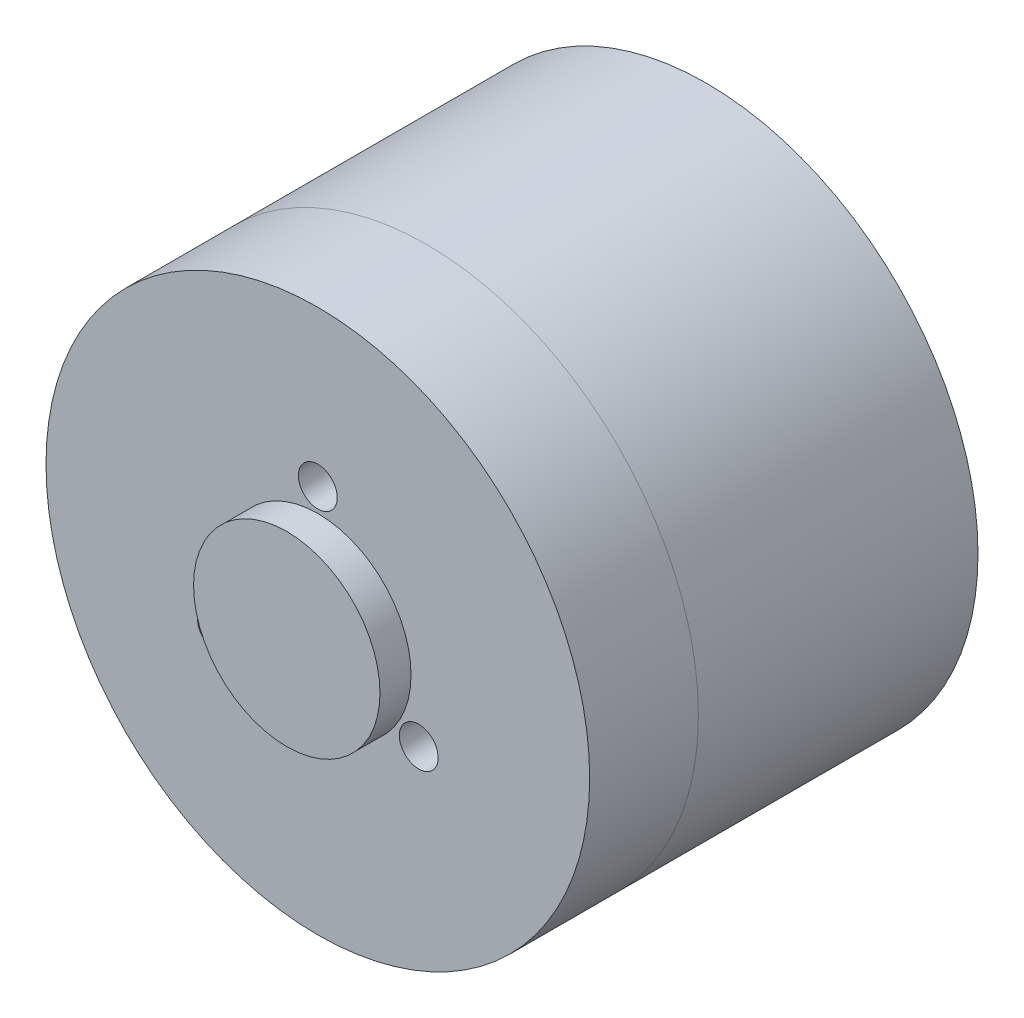
ISO-10303-21;
HEADER;
FILE_DESCRIPTION(('STEP AP214'),'2;1');
FILE_NAME('part.step','',(''),(''),'','','');
FILE_SCHEMA(('AUTOMOTIVE_DESIGN { 1 0 10303 214 1 1 1 1 }'));
ENDSEC;
DATA;
#1=APPLICATION_CONTEXT('core data for automotive mechanical design processes');
#2=APPLICATION_PROTOCOL_DEFINITION('international standard','automotive_design',2000,#1);
#3=PRODUCT_CONTEXT('',#1,'mechanical');
#4=PRODUCT('Part','Part','',(#3));
#5=PRODUCT_RELATED_PRODUCT_CATEGORY('part','',(#4));
#6=PRODUCT_DEFINITION_FORMATION('','',#4);
#7=PRODUCT_DEFINITION_CONTEXT('part definition',#1,'design');
#8=PRODUCT_DEFINITION('design','',#6,#7);
#9=PRODUCT_DEFINITION_SHAPE('','',#8);
#10=(LENGTH_UNIT() NAMED_UNIT(*) SI_UNIT(.MILLI.,.METRE.));
#11=(NAMED_UNIT(*) PLANE_ANGLE_UNIT() SI_UNIT($,.RADIAN.));
#12=(NAMED_UNIT(*) SI_UNIT($,.STERADIAN.) SOLID_ANGLE_UNIT());
#13=UNCERTAINTY_MEASURE_WITH_UNIT(LENGTH_MEASURE(1.E-05),#10,'distance_accuracy_value','');
#14=(GEOMETRIC_REPRESENTATION_CONTEXT(3) GLOBAL_UNCERTAINTY_ASSIGNED_CONTEXT((#13)) GLOBAL_UNIT_ASSIGNED_CONTEXT((#10,
#11,#12)) REPRESENTATION_CONTEXT('',''));
#15=CARTESIAN_POINT('',(0.,0.,0.));
#16=DIRECTION('',(0.,0.,1.));
#17=DIRECTION('',(1.,0.,0.));
#18=AXIS2_PLACEMENT_3D('',#15,#16,#17);
#19=CARTESIAN_POINT('',(0.,0.,-25.));
#20=DIRECTION('',(0.,0.,-1.));
#21=DIRECTION('',(-1.,0.,0.));
#22=AXIS2_PLACEMENT_3D('',#19,#20,#21);
#23=PLANE('',#22);
#24=CARTESIAN_POINT('',(0.,0.,-25.));
#25=DIRECTION('',(0.,0.,-1.));
#26=DIRECTION('',(-1.,0.,0.));
#27=AXIS2_PLACEMENT_3D('',#24,#25,#26);
#28=CIRCLE('',#27,17.5);
#29=CARTESIAN_POINT('',(-17.5,0.,-25.));
#30=VERTEX_POINT('',#29);
#31=EDGE_CURVE('E11',#30,#30,#28,.T.);
#32=ORIENTED_EDGE('',*,*,#31,.T.);
#33=EDGE_LOOP('',(#32));
#34=FACE_BOUND('',#33,.T.);
#35=CARTESIAN_POINT('',(0.,0.,-25.));
#36=DIRECTION('',(0.,0.,-1.));
#37=DIRECTION('',(-1.,0.,0.));
#38=AXIS2_PLACEMENT_3D('',#35,#36,#37);
#39=CIRCLE('',#38,15.);
#40=CARTESIAN_POINT('',(-15.,0.,-25.));
#41=VERTEX_POINT('',#40);
#42=EDGE_CURVE('E51',#41,#41,#39,.T.);
#43=ORIENTED_EDGE('',*,*,#42,.F.);
#44=EDGE_LOOP('',(#43));
#45=FACE_BOUND('',#44,.T.);
#46=ADVANCED_FACE('F40',(#34,#45),#23,.T.);
#47=CARTESIAN_POINT('',(0.,0.,-7.));
#48=DIRECTION('',(0.,0.,-1.));
#49=DIRECTION('',(-1.,0.,0.));
#50=AXIS2_PLACEMENT_3D('',#47,#48,#49);
#51=PLANE('',#50);
#52=CARTESIAN_POINT('',(0.,0.,-7.));
#53=DIRECTION('',(0.,0.,-1.));
#54=DIRECTION('',(-1.,0.,0.));
#55=AXIS2_PLACEMENT_3D('',#52,#53,#54);
#56=CIRCLE('',#55,17.5);
#57=CARTESIAN_POINT('',(-17.5,0.,-7.));
#58=VERTEX_POINT('',#57);
#59=EDGE_CURVE('E44',#58,#58,#56,.T.);
#60=ORIENTED_EDGE('',*,*,#59,.F.);
#61=EDGE_LOOP('',(#60));
#62=FACE_BOUND('',#61,.T.);
#63=CARTESIAN_POINT('',(0.,0.,-7.));
#64=DIRECTION('',(0.,0.,-1.));
#65=DIRECTION('',(-1.,0.,0.));
#66=AXIS2_PLACEMENT_3D('',#63,#64,#65);
#67=CIRCLE('',#66,15.);
#68=CARTESIAN_POINT('',(-15.,0.,-7.));
#69=VERTEX_POINT('',#68);
#70=EDGE_CURVE('E53',#69,#69,#67,.T.);
#71=ORIENTED_EDGE('',*,*,#70,.T.);
#72=EDGE_LOOP('',(#71));
#73=FACE_BOUND('',#72,.T.);
#74=ADVANCED_FACE('F63',(#62,#73),#51,.F.);
#75=CARTESIAN_POINT('',(0.,0.,-25.));
#76=DIRECTION('',(0.,0.,1.));
#77=DIRECTION('',(1.,0.,0.));
#78=AXIS2_PLACEMENT_3D('',#75,#76,#77);
#79=CYLINDRICAL_SURFACE('',#78,17.5);
#80=ORIENTED_EDGE('',*,*,#31,.F.);
#81=EDGE_LOOP('',(#80));
#82=FACE_BOUND('',#81,.T.);
#83=ORIENTED_EDGE('',*,*,#59,.T.);
#84=EDGE_LOOP('',(#83));
#85=FACE_BOUND('',#84,.T.);
#86=ADVANCED_FACE('F42',(#82,#85),#79,.T.);
#87=CARTESIAN_POINT('',(0.,0.,-25.));
#88=DIRECTION('',(0.,0.,1.));
#89=DIRECTION('',(1.,0.,0.));
#90=AXIS2_PLACEMENT_3D('',#87,#88,#89);
#91=CYLINDRICAL_SURFACE('',#90,15.);
#92=ORIENTED_EDGE('',*,*,#42,.T.);
#93=EDGE_LOOP('',(#92));
#94=FACE_BOUND('',#93,.T.);
#95=ORIENTED_EDGE('',*,*,#70,.F.);
#96=EDGE_LOOP('',(#95));
#97=FACE_BOUND('',#96,.T.);
#98=ADVANCED_FACE('F59',(#94,#97),#91,.F.);
#99=CLOSED_SHELL('',(#46,#74,#86,#98));
#100=MANIFOLD_SOLID_BREP('B2',#99);
#101=CARTESIAN_POINT('',(0.,0.,-4.));
#102=DIRECTION('',(0.,0.,1.));
#103=DIRECTION('',(1.,0.,0.));
#104=AXIS2_PLACEMENT_3D('',#101,#102,#103);
#105=PLANE('',#104);
#106=CARTESIAN_POINT('',(0.,7.5,-4.));
#107=DIRECTION('',(0.,0.,1.));
#108=DIRECTION('',(1.,0.,0.));
#109=AXIS2_PLACEMENT_3D('',#106,#107,#108);
#110=CIRCLE('',#109,1.25);
#111=CARTESIAN_POINT('',(1.25,7.5,-4.));
#112=VERTEX_POINT('',#111);
#113=EDGE_CURVE('E108',#112,#112,#110,.T.);
#114=ORIENTED_EDGE('',*,*,#113,.T.);
#115=EDGE_LOOP('',(#114));
#116=FACE_BOUND('',#115,.T.);
#117=CARTESIAN_POINT('',(6.49519052838377,-3.74999999999972,-4.));
#118=DIRECTION('',(0.,0.,1.));
#119=DIRECTION('',(1.,0.,0.));
#120=AXIS2_PLACEMENT_3D('',#117,#118,#119);
#121=CIRCLE('',#120,1.25000000000041);
#122=CARTESIAN_POINT('',(7.74519052838418,-3.74999999999972,-4.));
#123=VERTEX_POINT('',#122);
#124=EDGE_CURVE('E117',#123,#123,#121,.T.);
#125=ORIENTED_EDGE('',*,*,#124,.T.);
#126=EDGE_LOOP('',(#125));
#127=FACE_BOUND('',#126,.T.);
#128=CARTESIAN_POINT('',(-6.49519052838281,-3.75000000000028,-4.));
#129=DIRECTION('',(0.,0.,1.));
#130=DIRECTION('',(1.,0.,0.));
#131=AXIS2_PLACEMENT_3D('',#128,#129,#130);
#132=CIRCLE('',#131,1.25000000000061);
#133=CARTESIAN_POINT('',(-5.2451905283822,-3.75000000000028,-4.));
#134=VERTEX_POINT('',#133);
#135=EDGE_CURVE('E122',#134,#134,#132,.T.);
#136=ORIENTED_EDGE('',*,*,#135,.T.);
#137=EDGE_LOOP('',(#136));
#138=FACE_BOUND('',#137,.T.);
#139=CARTESIAN_POINT('',(0.,0.,-4.));
#140=DIRECTION('',(0.,0.,-1.));
#141=DIRECTION('',(-1.,0.,0.));
#142=AXIS2_PLACEMENT_3D('',#139,#140,#141);
#143=CIRCLE('',#142,15.);
#144=CARTESIAN_POINT('',(-15.,0.,-4.));
#145=VERTEX_POINT('',#144);
#146=EDGE_CURVE('E134',#145,#145,#143,.T.);
#147=ORIENTED_EDGE('',*,*,#146,.T.);
#148=EDGE_LOOP('',(#147));
#149=FACE_BOUND('',#148,.T.);
#150=ADVANCED_FACE('F101',(#116,#127,#138,#149),#105,.F.);
#151=CARTESIAN_POINT('',(0.,0.,-4.));
#152=DIRECTION('',(0.,0.,1.));
#153=DIRECTION('',(1.,0.,0.));
#154=AXIS2_PLACEMENT_3D('',#151,#152,#153);
#155=CYLINDRICAL_SURFACE('',#154,17.5);
#156=CARTESIAN_POINT('',(0.,0.,0.));
#157=DIRECTION('',(0.,0.,1.));
#158=DIRECTION('',(1.,0.,0.));
#159=AXIS2_PLACEMENT_3D('',#156,#157,#158);
#160=CIRCLE('',#159,17.5);
#161=CARTESIAN_POINT('',(17.5,0.,0.));
#162=VERTEX_POINT('',#161);
#163=EDGE_CURVE('E39',#162,#162,#160,.T.);
#164=ORIENTED_EDGE('',*,*,#163,.F.);
#165=EDGE_LOOP('',(#164));
#166=FACE_BOUND('',#165,.T.);
#167=CARTESIAN_POINT('',(0.,0.,-7.));
#168=DIRECTION('',(0.,0.,-1.));
#169=DIRECTION('',(-1.,0.,0.));
#170=AXIS2_PLACEMENT_3D('',#167,#168,#169);
#171=CIRCLE('',#170,17.5);
#172=CARTESIAN_POINT('',(-17.5,0.,-7.));
#173=VERTEX_POINT('',#172);
#174=EDGE_CURVE('E128',#173,#173,#171,.T.);
#175=ORIENTED_EDGE('',*,*,#174,.F.);
#176=EDGE_LOOP('',(#175));
#177=FACE_BOUND('',#176,.T.);
#178=ADVANCED_FACE('F103',(#166,#177),#155,.T.);
#179=CARTESIAN_POINT('',(0.,0.,0.));
#180=DIRECTION('',(0.,0.,1.));
#181=DIRECTION('',(1.,0.,0.));
#182=AXIS2_PLACEMENT_3D('',#179,#180,#181);
#183=PLANE('',#182);
#184=CARTESIAN_POINT('',(0.,0.,0.));
#185=DIRECTION('',(0.,0.,1.));
#186=DIRECTION('',(1.,0.,0.));
#187=AXIS2_PLACEMENT_3D('',#184,#185,#186);
#188=CIRCLE('',#187,6.);
#189=CARTESIAN_POINT('',(6.,0.,0.));
#190=VERTEX_POINT('',#189);
#191=EDGE_CURVE('E140',#190,#190,#188,.T.);
#192=ORIENTED_EDGE('',*,*,#191,.F.);
#193=EDGE_LOOP('',(#192));
#194=FACE_BOUND('',#193,.T.);
#195=CARTESIAN_POINT('',(-6.49519052838281,-3.75000000000028,0.));
#196=DIRECTION('',(0.,0.,1.));
#197=DIRECTION('',(1.,0.,0.));
#198=AXIS2_PLACEMENT_3D('',#195,#196,#197);
#199=CIRCLE('',#198,1.25000000000061);
#200=CARTESIAN_POINT('',(-5.2451905283822,-3.75000000000028,0.));
#201=VERTEX_POINT('',#200);
#202=EDGE_CURVE('E125',#201,#201,#199,.T.);
#203=ORIENTED_EDGE('',*,*,#202,.F.);
#204=EDGE_LOOP('',(#203));
#205=FACE_BOUND('',#204,.T.);
#206=CARTESIAN_POINT('',(6.49519052838377,-3.74999999999972,0.));
#207=DIRECTION('',(0.,0.,1.));
#208=DIRECTION('',(1.,0.,0.));
#209=AXIS2_PLACEMENT_3D('',#206,#207,#208);
#210=CIRCLE('',#209,1.25000000000041);
#211=CARTESIAN_POINT('',(7.74519052838418,-3.74999999999972,0.));
#212=VERTEX_POINT('',#211);
#213=EDGE_CURVE('E119',#212,#212,#210,.T.);
#214=ORIENTED_EDGE('',*,*,#213,.F.);
#215=EDGE_LOOP('',(#214));
#216=FACE_BOUND('',#215,.T.);
#217=CARTESIAN_POINT('',(0.,7.5,0.));
#218=DIRECTION('',(0.,0.,1.));
#219=DIRECTION('',(1.,0.,0.));
#220=AXIS2_PLACEMENT_3D('',#217,#218,#219);
#221=CIRCLE('',#220,1.25);
#222=CARTESIAN_POINT('',(1.25,7.5,0.));
#223=VERTEX_POINT('',#222);
#224=EDGE_CURVE('E112',#223,#223,#221,.T.);
#225=ORIENTED_EDGE('',*,*,#224,.F.);
#226=EDGE_LOOP('',(#225));
#227=FACE_BOUND('',#226,.T.);
#228=ORIENTED_EDGE('',*,*,#163,.T.);
#229=EDGE_LOOP('',(#228));
#230=FACE_BOUND('',#229,.T.);
#231=ADVANCED_FACE('F155',(#194,#205,#216,#227,#230),#183,.T.);
#232=CARTESIAN_POINT('',(0.,7.5,-4.));
#233=DIRECTION('',(0.,0.,1.));
#234=DIRECTION('',(1.,0.,0.));
#235=AXIS2_PLACEMENT_3D('',#232,#233,#234);
#236=CYLINDRICAL_SURFACE('',#235,1.25);
#237=ORIENTED_EDGE('',*,*,#113,.F.);
#238=EDGE_LOOP('',(#237));
#239=FACE_BOUND('',#238,.T.);
#240=ORIENTED_EDGE('',*,*,#224,.T.);
#241=EDGE_LOOP('',(#240));
#242=FACE_BOUND('',#241,.T.);
#243=ADVANCED_FACE('F158',(#239,#242),#236,.F.);
#244=CARTESIAN_POINT('',(6.49519052838377,-3.74999999999972,-4.));
#245=DIRECTION('',(0.,0.,1.));
#246=DIRECTION('',(1.,0.,0.));
#247=AXIS2_PLACEMENT_3D('',#244,#245,#246);
#248=CYLINDRICAL_SURFACE('',#247,1.25000000000041);
#249=ORIENTED_EDGE('',*,*,#124,.F.);
#250=EDGE_LOOP('',(#249));
#251=FACE_BOUND('',#250,.T.);
#252=ORIENTED_EDGE('',*,*,#213,.T.);
#253=EDGE_LOOP('',(#252));
#254=FACE_BOUND('',#253,.T.);
#255=ADVANCED_FACE('F166',(#251,#254),#248,.F.);
#256=CARTESIAN_POINT('',(-6.49519052838281,-3.75000000000028,-4.));
#257=DIRECTION('',(0.,0.,1.));
#258=DIRECTION('',(1.,0.,0.));
#259=AXIS2_PLACEMENT_3D('',#256,#257,#258);
#260=CYLINDRICAL_SURFACE('',#259,1.25000000000061);
#261=ORIENTED_EDGE('',*,*,#135,.F.);
#262=EDGE_LOOP('',(#261));
#263=FACE_BOUND('',#262,.T.);
#264=ORIENTED_EDGE('',*,*,#202,.T.);
#265=EDGE_LOOP('',(#264));
#266=FACE_BOUND('',#265,.T.);
#267=ADVANCED_FACE('F172',(#263,#266),#260,.F.);
#268=CARTESIAN_POINT('',(0.,0.,-7.));
#269=DIRECTION('',(0.,0.,-1.));
#270=DIRECTION('',(-1.,0.,0.));
#271=AXIS2_PLACEMENT_3D('',#268,#269,#270);
#272=PLANE('',#271);
#273=ORIENTED_EDGE('',*,*,#174,.T.);
#274=EDGE_LOOP('',(#273));
#275=FACE_BOUND('',#274,.T.);
#276=CARTESIAN_POINT('',(0.,0.,-7.));
#277=DIRECTION('',(0.,0.,-1.));
#278=DIRECTION('',(-1.,0.,0.));
#279=AXIS2_PLACEMENT_3D('',#276,#277,#278);
#280=CIRCLE('',#279,15.);
#281=CARTESIAN_POINT('',(-15.,0.,-7.));
#282=VERTEX_POINT('',#281);
#283=EDGE_CURVE('E133',#282,#282,#280,.T.);
#284=ORIENTED_EDGE('',*,*,#283,.F.);
#285=EDGE_LOOP('',(#284));
#286=FACE_BOUND('',#285,.T.);
#287=ADVANCED_FACE('F189',(#275,#286),#272,.T.);
#288=CARTESIAN_POINT('',(0.,0.,-7.));
#289=DIRECTION('',(0.,0.,1.));
#290=DIRECTION('',(1.,0.,0.));
#291=AXIS2_PLACEMENT_3D('',#288,#289,#290);
#292=CYLINDRICAL_SURFACE('',#291,15.);
#293=ORIENTED_EDGE('',*,*,#283,.T.);
#294=EDGE_LOOP('',(#293));
#295=FACE_BOUND('',#294,.T.);
#296=ORIENTED_EDGE('',*,*,#146,.F.);
#297=EDGE_LOOP('',(#296));
#298=FACE_BOUND('',#297,.T.);
#299=ADVANCED_FACE('F151',(#295,#298),#292,.F.);
#300=CARTESIAN_POINT('',(0.,0.,2.));
#301=DIRECTION('',(0.,0.,-1.));
#302=DIRECTION('',(-1.,0.,0.));
#303=AXIS2_PLACEMENT_3D('',#300,#301,#302);
#304=CYLINDRICAL_SURFACE('',#303,6.);
#305=CARTESIAN_POINT('',(0.,0.,2.));
#306=DIRECTION('',(0.,0.,1.));
#307=DIRECTION('',(1.,0.,0.));
#308=AXIS2_PLACEMENT_3D('',#305,#306,#307);
#309=CIRCLE('',#308,6.);
#310=CARTESIAN_POINT('',(6.,0.,2.));
#311=VERTEX_POINT('',#310);
#312=EDGE_CURVE('E137',#311,#311,#309,.T.);
#313=ORIENTED_EDGE('',*,*,#312,.F.);
#314=EDGE_LOOP('',(#313));
#315=FACE_BOUND('',#314,.T.);
#316=ORIENTED_EDGE('',*,*,#191,.T.);
#317=EDGE_LOOP('',(#316));
#318=FACE_BOUND('',#317,.T.);
#319=ADVANCED_FACE('F148',(#315,#318),#304,.T.);
#320=CARTESIAN_POINT('',(0.,0.,2.));
#321=DIRECTION('',(0.,0.,1.));
#322=DIRECTION('',(1.,0.,0.));
#323=AXIS2_PLACEMENT_3D('',#320,#321,#322);
#324=PLANE('',#323);
#325=ORIENTED_EDGE('',*,*,#312,.T.);
#326=EDGE_LOOP('',(#325));
#327=FACE_BOUND('',#326,.T.);
#328=ADVANCED_FACE('F146',(#327),#324,.T.);
#329=CLOSED_SHELL('',(#150,#178,#231,#243,#255,#267,#287,#299,#319,#328));
#330=MANIFOLD_SOLID_BREP('B6',#329);
#331=ADVANCED_BREP_SHAPE_REPRESENTATION('',(#18,#100,#330),#14);
#332=SHAPE_DEFINITION_REPRESENTATION(#9,#331);
ENDSEC;
END-ISO-10303-21;
